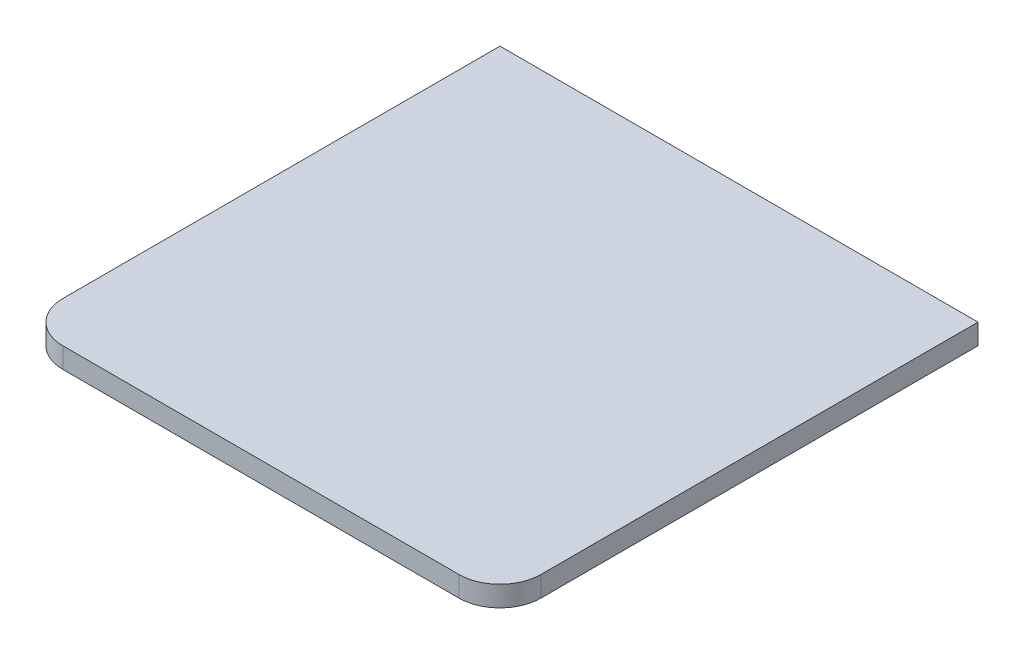
ISO-10303-21;
HEADER;
FILE_DESCRIPTION(('STEP AP214'),'2;1');
FILE_NAME('part.step','',(''),(''),'','','');
FILE_SCHEMA(('AUTOMOTIVE_DESIGN { 1 0 10303 214 1 1 1 1 }'));
ENDSEC;
DATA;
#1=APPLICATION_CONTEXT('core data for automotive mechanical design processes');
#2=APPLICATION_PROTOCOL_DEFINITION('international standard','automotive_design',2000,#1);
#3=PRODUCT_CONTEXT('',#1,'mechanical');
#4=PRODUCT('Part','Part','',(#3));
#5=PRODUCT_RELATED_PRODUCT_CATEGORY('part','',(#4));
#6=PRODUCT_DEFINITION_FORMATION('','',#4);
#7=PRODUCT_DEFINITION_CONTEXT('part definition',#1,'design');
#8=PRODUCT_DEFINITION('design','',#6,#7);
#9=PRODUCT_DEFINITION_SHAPE('','',#8);
#10=(LENGTH_UNIT() NAMED_UNIT(*) SI_UNIT(.MILLI.,.METRE.));
#11=(NAMED_UNIT(*) PLANE_ANGLE_UNIT() SI_UNIT($,.RADIAN.));
#12=(NAMED_UNIT(*) SI_UNIT($,.STERADIAN.) SOLID_ANGLE_UNIT());
#13=UNCERTAINTY_MEASURE_WITH_UNIT(LENGTH_MEASURE(1.E-05),#10,'distance_accuracy_value','');
#14=(GEOMETRIC_REPRESENTATION_CONTEXT(3) GLOBAL_UNCERTAINTY_ASSIGNED_CONTEXT((#13)) GLOBAL_UNIT_ASSIGNED_CONTEXT((#10,
#11,#12)) REPRESENTATION_CONTEXT('',''));
#15=CARTESIAN_POINT('',(0.,0.,0.));
#16=DIRECTION('',(0.,0.,1.));
#17=DIRECTION('',(1.,0.,0.));
#18=AXIS2_PLACEMENT_3D('',#15,#16,#17);
#19=CARTESIAN_POINT('',(35.,3.,-35.));
#20=DIRECTION('',(-1.,0.,0.));
#21=DIRECTION('',(0.,0.,1.));
#22=AXIS2_PLACEMENT_3D('',#19,#20,#21);
#23=PLANE('',#22);
#24=DIRECTION('',(0.,0.,-1.));
#25=VECTOR('',#24,1.);
#26=CARTESIAN_POINT('',(35.,3.,-35.));
#27=LINE('',#26,#25);
#28=CARTESIAN_POINT('',(35.,3.,29.));
#29=VERTEX_POINT('',#28);
#30=CARTESIAN_POINT('',(35.,3.,-35.));
#31=VERTEX_POINT('',#30);
#32=EDGE_CURVE('E87',#29,#31,#27,.T.);
#33=ORIENTED_EDGE('',*,*,#32,.F.);
#34=DIRECTION('',(0.,-1.,0.));
#35=VECTOR('',#34,1.);
#36=CARTESIAN_POINT('',(35.,3.,29.));
#37=LINE('',#36,#35);
#38=CARTESIAN_POINT('',(35.,0.,29.));
#39=VERTEX_POINT('',#38);
#40=EDGE_CURVE('E11',#29,#39,#37,.T.);
#41=ORIENTED_EDGE('',*,*,#40,.T.);
#42=DIRECTION('',(0.,0.,-1.));
#43=VECTOR('',#42,1.);
#44=CARTESIAN_POINT('',(35.,0.,-35.));
#45=LINE('',#44,#43);
#46=CARTESIAN_POINT('',(35.,0.,-35.));
#47=VERTEX_POINT('',#46);
#48=EDGE_CURVE('E106',#39,#47,#45,.T.);
#49=ORIENTED_EDGE('',*,*,#48,.T.);
#50=DIRECTION('',(0.,-1.,0.));
#51=VECTOR('',#50,1.);
#52=CARTESIAN_POINT('',(35.,3.,-35.));
#53=LINE('',#52,#51);
#54=EDGE_CURVE('E100',#31,#47,#53,.T.);
#55=ORIENTED_EDGE('',*,*,#54,.F.);
#56=EDGE_LOOP('',(#33,#41,#49,#55));
#57=FACE_BOUND('',#56,.T.);
#58=ADVANCED_FACE('F34',(#57),#23,.F.);
#59=CARTESIAN_POINT('',(-35.,3.,-35.));
#60=DIRECTION('',(0.,0.,1.));
#61=DIRECTION('',(1.,0.,0.));
#62=AXIS2_PLACEMENT_3D('',#59,#60,#61);
#63=PLANE('',#62);
#64=DIRECTION('',(-1.,0.,0.));
#65=VECTOR('',#64,1.);
#66=CARTESIAN_POINT('',(-35.,0.,-35.));
#67=LINE('',#66,#65);
#68=CARTESIAN_POINT('',(-35.,0.,-35.));
#69=VERTEX_POINT('',#68);
#70=EDGE_CURVE('E139',#47,#69,#67,.T.);
#71=ORIENTED_EDGE('',*,*,#70,.T.);
#72=DIRECTION('',(0.,-1.,0.));
#73=VECTOR('',#72,1.);
#74=CARTESIAN_POINT('',(-35.,3.,-35.));
#75=LINE('',#74,#73);
#76=CARTESIAN_POINT('',(-35.,3.,-35.));
#77=VERTEX_POINT('',#76);
#78=EDGE_CURVE('E102',#77,#69,#75,.T.);
#79=ORIENTED_EDGE('',*,*,#78,.F.);
#80=DIRECTION('',(-1.,0.,0.));
#81=VECTOR('',#80,1.);
#82=CARTESIAN_POINT('',(-35.,3.,-35.));
#83=LINE('',#82,#81);
#84=EDGE_CURVE('E90',#31,#77,#83,.T.);
#85=ORIENTED_EDGE('',*,*,#84,.F.);
#86=ORIENTED_EDGE('',*,*,#54,.T.);
#87=EDGE_LOOP('',(#71,#79,#85,#86));
#88=FACE_BOUND('',#87,.T.);
#89=ADVANCED_FACE('F99',(#88),#63,.F.);
#90=CARTESIAN_POINT('',(-35.,3.,-35.));
#91=DIRECTION('',(1.,0.,0.));
#92=DIRECTION('',(0.,0.,-1.));
#93=AXIS2_PLACEMENT_3D('',#90,#91,#92);
#94=PLANE('',#93);
#95=DIRECTION('',(0.,0.,1.));
#96=VECTOR('',#95,1.);
#97=CARTESIAN_POINT('',(-35.,0.,-35.));
#98=LINE('',#97,#96);
#99=CARTESIAN_POINT('',(-35.,0.,29.));
#100=VERTEX_POINT('',#99);
#101=EDGE_CURVE('E137',#69,#100,#98,.T.);
#102=ORIENTED_EDGE('',*,*,#101,.T.);
#103=DIRECTION('',(0.,-1.,0.));
#104=VECTOR('',#103,1.);
#105=CARTESIAN_POINT('',(-35.,3.,29.));
#106=LINE('',#105,#104);
#107=CARTESIAN_POINT('',(-35.,3.,29.));
#108=VERTEX_POINT('',#107);
#109=EDGE_CURVE('E57',#100,#108,#106,.F.);
#110=ORIENTED_EDGE('',*,*,#109,.T.);
#111=DIRECTION('',(0.,0.,1.));
#112=VECTOR('',#111,1.);
#113=CARTESIAN_POINT('',(-35.,3.,-35.));
#114=LINE('',#113,#112);
#115=EDGE_CURVE('E103',#77,#108,#114,.T.);
#116=ORIENTED_EDGE('',*,*,#115,.F.);
#117=ORIENTED_EDGE('',*,*,#78,.T.);
#118=EDGE_LOOP('',(#102,#110,#116,#117));
#119=FACE_BOUND('',#118,.T.);
#120=ADVANCED_FACE('F138',(#119),#94,.F.);
#121=CARTESIAN_POINT('',(-35.,3.,35.));
#122=DIRECTION('',(0.,0.,-1.));
#123=DIRECTION('',(-1.,0.,0.));
#124=AXIS2_PLACEMENT_3D('',#121,#122,#123);
#125=PLANE('',#124);
#126=DIRECTION('',(1.,0.,0.));
#127=VECTOR('',#126,1.);
#128=CARTESIAN_POINT('',(-35.,3.,35.));
#129=LINE('',#128,#127);
#130=CARTESIAN_POINT('',(-29.,3.,35.));
#131=VERTEX_POINT('',#130);
#132=CARTESIAN_POINT('',(29.,3.,35.));
#133=VERTEX_POINT('',#132);
#134=EDGE_CURVE('E112',#131,#133,#129,.T.);
#135=ORIENTED_EDGE('',*,*,#134,.F.);
#136=DIRECTION('',(0.,-1.,0.));
#137=VECTOR('',#136,1.);
#138=CARTESIAN_POINT('',(-29.,3.,35.));
#139=LINE('',#138,#137);
#140=CARTESIAN_POINT('',(-29.,0.,35.));
#141=VERTEX_POINT('',#140);
#142=EDGE_CURVE('E110',#131,#141,#139,.T.);
#143=ORIENTED_EDGE('',*,*,#142,.T.);
#144=DIRECTION('',(1.,0.,0.));
#145=VECTOR('',#144,1.);
#146=CARTESIAN_POINT('',(-35.,0.,35.));
#147=LINE('',#146,#145);
#148=CARTESIAN_POINT('',(29.,0.,35.));
#149=VERTEX_POINT('',#148);
#150=EDGE_CURVE('E95',#141,#149,#147,.T.);
#151=ORIENTED_EDGE('',*,*,#150,.T.);
#152=DIRECTION('',(0.,-1.,0.));
#153=VECTOR('',#152,1.);
#154=CARTESIAN_POINT('',(29.,3.,35.));
#155=LINE('',#154,#153);
#156=EDGE_CURVE('E108',#149,#133,#155,.F.);
#157=ORIENTED_EDGE('',*,*,#156,.T.);
#158=EDGE_LOOP('',(#135,#143,#151,#157));
#159=FACE_BOUND('',#158,.T.);
#160=ADVANCED_FACE('F128',(#159),#125,.F.);
#161=CARTESIAN_POINT('',(0.,3.,0.));
#162=DIRECTION('',(0.,1.,0.));
#163=DIRECTION('',(0.,0.,1.));
#164=AXIS2_PLACEMENT_3D('',#161,#162,#163);
#165=PLANE('',#164);
#166=ORIENTED_EDGE('',*,*,#115,.T.);
#167=CARTESIAN_POINT('',(-29.,3.,29.));
#168=DIRECTION('',(0.,1.,0.));
#169=DIRECTION('',(0.,0.,1.));
#170=AXIS2_PLACEMENT_3D('',#167,#168,#169);
#171=CIRCLE('',#170,6.);
#172=EDGE_CURVE('E42',#108,#131,#171,.T.);
#173=ORIENTED_EDGE('',*,*,#172,.T.);
#174=ORIENTED_EDGE('',*,*,#134,.T.);
#175=CARTESIAN_POINT('',(29.,3.,29.));
#176=DIRECTION('',(0.,1.,0.));
#177=DIRECTION('',(0.,0.,1.));
#178=AXIS2_PLACEMENT_3D('',#175,#176,#177);
#179=CIRCLE('',#178,6.);
#180=EDGE_CURVE('E49',#133,#29,#179,.T.);
#181=ORIENTED_EDGE('',*,*,#180,.T.);
#182=ORIENTED_EDGE('',*,*,#32,.T.);
#183=ORIENTED_EDGE('',*,*,#84,.T.);
#184=EDGE_LOOP('',(#166,#173,#174,#181,#182,#183));
#185=FACE_BOUND('',#184,.T.);
#186=ADVANCED_FACE('F89',(#185),#165,.T.);
#187=CARTESIAN_POINT('',(0.,0.,0.));
#188=DIRECTION('',(0.,1.,0.));
#189=DIRECTION('',(0.,0.,1.));
#190=AXIS2_PLACEMENT_3D('',#187,#188,#189);
#191=PLANE('',#190);
#192=ORIENTED_EDGE('',*,*,#150,.F.);
#193=CARTESIAN_POINT('',(-29.,0.,29.));
#194=DIRECTION('',(0.,1.,0.));
#195=DIRECTION('',(0.,0.,1.));
#196=AXIS2_PLACEMENT_3D('',#193,#194,#195);
#197=CIRCLE('',#196,6.);
#198=EDGE_CURVE('E120',#141,#100,#197,.F.);
#199=ORIENTED_EDGE('',*,*,#198,.T.);
#200=ORIENTED_EDGE('',*,*,#101,.F.);
#201=ORIENTED_EDGE('',*,*,#70,.F.);
#202=ORIENTED_EDGE('',*,*,#48,.F.);
#203=CARTESIAN_POINT('',(29.,0.,29.));
#204=DIRECTION('',(0.,1.,0.));
#205=DIRECTION('',(0.,0.,1.));
#206=AXIS2_PLACEMENT_3D('',#203,#204,#205);
#207=CIRCLE('',#206,6.);
#208=EDGE_CURVE('E118',#39,#149,#207,.F.);
#209=ORIENTED_EDGE('',*,*,#208,.T.);
#210=EDGE_LOOP('',(#192,#199,#200,#201,#202,#209));
#211=FACE_BOUND('',#210,.T.);
#212=ADVANCED_FACE('F136',(#211),#191,.F.);
#213=CARTESIAN_POINT('',(-29.,3.,29.));
#214=DIRECTION('',(0.,-1.,0.));
#215=DIRECTION('',(0.,0.,-1.));
#216=AXIS2_PLACEMENT_3D('',#213,#214,#215);
#217=CYLINDRICAL_SURFACE('',#216,6.);
#218=ORIENTED_EDGE('',*,*,#172,.F.);
#219=ORIENTED_EDGE('',*,*,#109,.F.);
#220=ORIENTED_EDGE('',*,*,#198,.F.);
#221=ORIENTED_EDGE('',*,*,#142,.F.);
#222=EDGE_LOOP('',(#218,#219,#220,#221));
#223=FACE_BOUND('',#222,.T.);
#224=ADVANCED_FACE('F133',(#223),#217,.T.);
#225=CARTESIAN_POINT('',(29.,3.,29.));
#226=DIRECTION('',(0.,-1.,0.));
#227=DIRECTION('',(0.,0.,-1.));
#228=AXIS2_PLACEMENT_3D('',#225,#226,#227);
#229=CYLINDRICAL_SURFACE('',#228,6.);
#230=ORIENTED_EDGE('',*,*,#180,.F.);
#231=ORIENTED_EDGE('',*,*,#156,.F.);
#232=ORIENTED_EDGE('',*,*,#208,.F.);
#233=ORIENTED_EDGE('',*,*,#40,.F.);
#234=EDGE_LOOP('',(#230,#231,#232,#233));
#235=FACE_BOUND('',#234,.T.);
#236=ADVANCED_FACE('F36',(#235),#229,.T.);
#237=CLOSED_SHELL('',(#58,#89,#120,#160,#186,#212,#224,#236));
#238=MANIFOLD_SOLID_BREP('B2',#237);
#239=ADVANCED_BREP_SHAPE_REPRESENTATION('',(#18,#238),#14);
#240=SHAPE_DEFINITION_REPRESENTATION(#9,#239);
ENDSEC;
END-ISO-10303-21;
